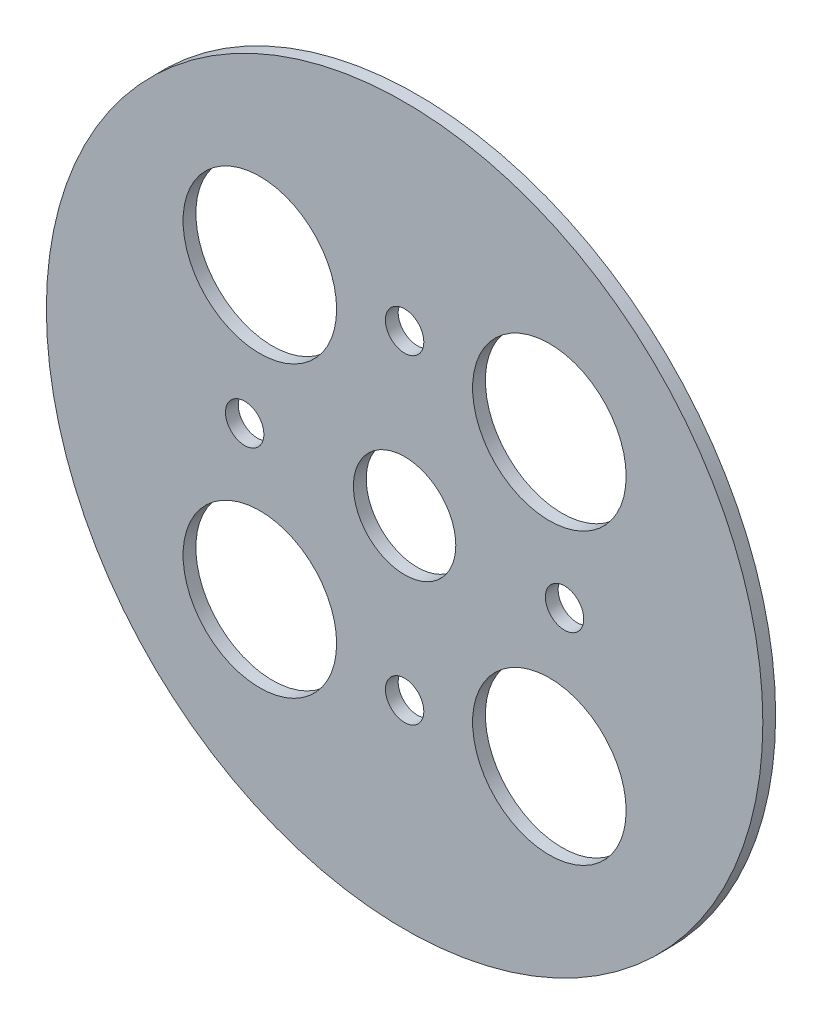
ISO-10303-21;
HEADER;
FILE_DESCRIPTION(('STEP AP214'),'2;1');
FILE_NAME('part.step','',(''),(''),'','','');
FILE_SCHEMA(('AUTOMOTIVE_DESIGN { 1 0 10303 214 1 1 1 1 }'));
ENDSEC;
DATA;
#1=APPLICATION_CONTEXT('core data for automotive mechanical design processes');
#2=APPLICATION_PROTOCOL_DEFINITION('international standard','automotive_design',2000,#1);
#3=PRODUCT_CONTEXT('',#1,'mechanical');
#4=PRODUCT('Part','Part','',(#3));
#5=PRODUCT_RELATED_PRODUCT_CATEGORY('part','',(#4));
#6=PRODUCT_DEFINITION_FORMATION('','',#4);
#7=PRODUCT_DEFINITION_CONTEXT('part definition',#1,'design');
#8=PRODUCT_DEFINITION('design','',#6,#7);
#9=PRODUCT_DEFINITION_SHAPE('','',#8);
#10=(LENGTH_UNIT() NAMED_UNIT(*) SI_UNIT(.MILLI.,.METRE.));
#11=(NAMED_UNIT(*) PLANE_ANGLE_UNIT() SI_UNIT($,.RADIAN.));
#12=(NAMED_UNIT(*) SI_UNIT($,.STERADIAN.) SOLID_ANGLE_UNIT());
#13=UNCERTAINTY_MEASURE_WITH_UNIT(LENGTH_MEASURE(1.E-05),#10,'distance_accuracy_value','');
#14=(GEOMETRIC_REPRESENTATION_CONTEXT(3) GLOBAL_UNCERTAINTY_ASSIGNED_CONTEXT((#13)) GLOBAL_UNIT_ASSIGNED_CONTEXT((#10,
#11,#12)) REPRESENTATION_CONTEXT('',''));
#15=CARTESIAN_POINT('',(0.,0.,0.));
#16=DIRECTION('',(0.,0.,1.));
#17=DIRECTION('',(1.,0.,0.));
#18=AXIS2_PLACEMENT_3D('',#15,#16,#17);
#19=CARTESIAN_POINT('',(0.,0.,1.));
#20=DIRECTION('',(0.,0.,-1.));
#21=DIRECTION('',(-1.,0.,0.));
#22=AXIS2_PLACEMENT_3D('',#19,#20,#21);
#23=CYLINDRICAL_SURFACE('',#22,28.);
#24=CARTESIAN_POINT('',(0.,0.,1.));
#25=DIRECTION('',(0.,0.,1.));
#26=DIRECTION('',(1.,0.,0.));
#27=AXIS2_PLACEMENT_3D('',#24,#25,#26);
#28=CIRCLE('',#27,28.);
#29=CARTESIAN_POINT('',(28.,0.,1.));
#30=VERTEX_POINT('',#29);
#31=EDGE_CURVE('E10',#30,#30,#28,.T.);
#32=ORIENTED_EDGE('',*,*,#31,.F.);
#33=EDGE_LOOP('',(#32));
#34=FACE_BOUND('',#33,.T.);
#35=CARTESIAN_POINT('',(0.,0.,0.));
#36=DIRECTION('',(0.,0.,1.));
#37=DIRECTION('',(1.,0.,0.));
#38=AXIS2_PLACEMENT_3D('',#35,#36,#37);
#39=CIRCLE('',#38,28.);
#40=CARTESIAN_POINT('',(28.,0.,0.));
#41=VERTEX_POINT('',#40);
#42=EDGE_CURVE('E36',#41,#41,#39,.T.);
#43=ORIENTED_EDGE('',*,*,#42,.T.);
#44=EDGE_LOOP('',(#43));
#45=FACE_BOUND('',#44,.T.);
#46=ADVANCED_FACE('F33',(#34,#45),#23,.T.);
#47=CARTESIAN_POINT('',(0.,0.,1.));
#48=DIRECTION('',(0.,0.,1.));
#49=DIRECTION('',(1.,0.,0.));
#50=AXIS2_PLACEMENT_3D('',#47,#48,#49);
#51=PLANE('',#50);
#52=CARTESIAN_POINT('',(11.3137084989847,11.3137084989848,1.));
#53=DIRECTION('',(0.,0.,1.));
#54=DIRECTION('',(1.,0.,0.));
#55=AXIS2_PLACEMENT_3D('',#52,#53,#54);
#56=CIRCLE('',#55,6.);
#57=CARTESIAN_POINT('',(17.3137084989847,11.3137084989848,1.));
#58=VERTEX_POINT('',#57);
#59=EDGE_CURVE('E85',#58,#58,#56,.T.);
#60=ORIENTED_EDGE('',*,*,#59,.F.);
#61=EDGE_LOOP('',(#60));
#62=FACE_BOUND('',#61,.T.);
#63=CARTESIAN_POINT('',(-11.3137084989848,11.3137084989847,1.));
#64=DIRECTION('',(0.,0.,1.));
#65=DIRECTION('',(1.,0.,0.));
#66=AXIS2_PLACEMENT_3D('',#63,#64,#65);
#67=CIRCLE('',#66,6.);
#68=CARTESIAN_POINT('',(-5.31370849898478,11.3137084989847,1.));
#69=VERTEX_POINT('',#68);
#70=EDGE_CURVE('E84',#69,#69,#67,.T.);
#71=ORIENTED_EDGE('',*,*,#70,.F.);
#72=EDGE_LOOP('',(#71));
#73=FACE_BOUND('',#72,.T.);
#74=CARTESIAN_POINT('',(-11.3137084989847,-11.3137084989848,1.));
#75=DIRECTION('',(0.,0.,1.));
#76=DIRECTION('',(1.,0.,0.));
#77=AXIS2_PLACEMENT_3D('',#74,#75,#76);
#78=CIRCLE('',#77,6.);
#79=CARTESIAN_POINT('',(-5.31370849898474,-11.3137084989848,1.));
#80=VERTEX_POINT('',#79);
#81=EDGE_CURVE('E91',#80,#80,#78,.T.);
#82=ORIENTED_EDGE('',*,*,#81,.F.);
#83=EDGE_LOOP('',(#82));
#84=FACE_BOUND('',#83,.T.);
#85=CARTESIAN_POINT('',(11.3137084989848,-11.3137084989847,1.));
#86=DIRECTION('',(0.,0.,1.));
#87=DIRECTION('',(1.,0.,0.));
#88=AXIS2_PLACEMENT_3D('',#85,#86,#87);
#89=CIRCLE('',#88,6.);
#90=CARTESIAN_POINT('',(17.3137084989848,-11.3137084989847,1.));
#91=VERTEX_POINT('',#90);
#92=EDGE_CURVE('E77',#91,#91,#89,.T.);
#93=ORIENTED_EDGE('',*,*,#92,.F.);
#94=EDGE_LOOP('',(#93));
#95=FACE_BOUND('',#94,.T.);
#96=CARTESIAN_POINT('',(0.,12.5,1.));
#97=DIRECTION('',(0.,0.,1.));
#98=DIRECTION('',(1.,0.,0.));
#99=AXIS2_PLACEMENT_3D('',#96,#97,#98);
#100=CIRCLE('',#99,1.5);
#101=CARTESIAN_POINT('',(1.5,12.5,1.));
#102=VERTEX_POINT('',#101);
#103=EDGE_CURVE('E68',#102,#102,#100,.T.);
#104=ORIENTED_EDGE('',*,*,#103,.F.);
#105=EDGE_LOOP('',(#104));
#106=FACE_BOUND('',#105,.T.);
#107=CARTESIAN_POINT('',(0.,-12.5,1.));
#108=DIRECTION('',(0.,0.,1.));
#109=DIRECTION('',(1.,0.,0.));
#110=AXIS2_PLACEMENT_3D('',#107,#108,#109);
#111=CIRCLE('',#110,1.5);
#112=CARTESIAN_POINT('',(1.5,-12.5,1.));
#113=VERTEX_POINT('',#112);
#114=EDGE_CURVE('E62',#113,#113,#111,.T.);
#115=ORIENTED_EDGE('',*,*,#114,.F.);
#116=EDGE_LOOP('',(#115));
#117=FACE_BOUND('',#116,.T.);
#118=CARTESIAN_POINT('',(12.5,0.,1.));
#119=DIRECTION('',(0.,0.,1.));
#120=DIRECTION('',(1.,0.,0.));
#121=AXIS2_PLACEMENT_3D('',#118,#119,#120);
#122=CIRCLE('',#121,1.5);
#123=CARTESIAN_POINT('',(14.,0.,1.));
#124=VERTEX_POINT('',#123);
#125=EDGE_CURVE('E54',#124,#124,#122,.T.);
#126=ORIENTED_EDGE('',*,*,#125,.F.);
#127=EDGE_LOOP('',(#126));
#128=FACE_BOUND('',#127,.T.);
#129=CARTESIAN_POINT('',(-12.5,0.,1.));
#130=DIRECTION('',(0.,0.,1.));
#131=DIRECTION('',(1.,0.,0.));
#132=AXIS2_PLACEMENT_3D('',#129,#130,#131);
#133=CIRCLE('',#132,1.5);
#134=CARTESIAN_POINT('',(-11.,0.,1.));
#135=VERTEX_POINT('',#134);
#136=EDGE_CURVE('E55',#135,#135,#133,.T.);
#137=ORIENTED_EDGE('',*,*,#136,.F.);
#138=EDGE_LOOP('',(#137));
#139=FACE_BOUND('',#138,.T.);
#140=CARTESIAN_POINT('',(0.,0.,1.));
#141=DIRECTION('',(0.,0.,1.));
#142=DIRECTION('',(1.,0.,0.));
#143=AXIS2_PLACEMENT_3D('',#140,#141,#142);
#144=CIRCLE('',#143,4.);
#145=CARTESIAN_POINT('',(4.,0.,1.));
#146=VERTEX_POINT('',#145);
#147=EDGE_CURVE('E45',#146,#146,#144,.T.);
#148=ORIENTED_EDGE('',*,*,#147,.F.);
#149=EDGE_LOOP('',(#148));
#150=FACE_BOUND('',#149,.T.);
#151=ORIENTED_EDGE('',*,*,#31,.T.);
#152=EDGE_LOOP('',(#151));
#153=FACE_BOUND('',#152,.T.);
#154=ADVANCED_FACE('F102',(#62,#73,#84,#95,#106,#117,#128,#139,#150,#153),#51,.T.);
#155=CARTESIAN_POINT('',(0.,0.,0.));
#156=DIRECTION('',(0.,0.,1.));
#157=DIRECTION('',(1.,0.,0.));
#158=AXIS2_PLACEMENT_3D('',#155,#156,#157);
#159=PLANE('',#158);
#160=CARTESIAN_POINT('',(11.3137084989847,11.3137084989848,0.));
#161=DIRECTION('',(0.,0.,1.));
#162=DIRECTION('',(1.,0.,0.));
#163=AXIS2_PLACEMENT_3D('',#160,#161,#162);
#164=CIRCLE('',#163,6.);
#165=CARTESIAN_POINT('',(17.3137084989847,11.3137084989848,0.));
#166=VERTEX_POINT('',#165);
#167=EDGE_CURVE('E81',#166,#166,#164,.F.);
#168=ORIENTED_EDGE('',*,*,#167,.F.);
#169=EDGE_LOOP('',(#168));
#170=FACE_BOUND('',#169,.T.);
#171=CARTESIAN_POINT('',(-11.3137084989848,11.3137084989847,0.));
#172=DIRECTION('',(0.,0.,1.));
#173=DIRECTION('',(1.,0.,0.));
#174=AXIS2_PLACEMENT_3D('',#171,#172,#173);
#175=CIRCLE('',#174,6.);
#176=CARTESIAN_POINT('',(-5.31370849898478,11.3137084989847,0.));
#177=VERTEX_POINT('',#176);
#178=EDGE_CURVE('E88',#177,#177,#175,.F.);
#179=ORIENTED_EDGE('',*,*,#178,.F.);
#180=EDGE_LOOP('',(#179));
#181=FACE_BOUND('',#180,.T.);
#182=CARTESIAN_POINT('',(-11.3137084989847,-11.3137084989848,0.));
#183=DIRECTION('',(0.,0.,1.));
#184=DIRECTION('',(1.,0.,0.));
#185=AXIS2_PLACEMENT_3D('',#182,#183,#184);
#186=CIRCLE('',#185,6.);
#187=CARTESIAN_POINT('',(-5.31370849898474,-11.3137084989848,0.));
#188=VERTEX_POINT('',#187);
#189=EDGE_CURVE('E80',#188,#188,#186,.F.);
#190=ORIENTED_EDGE('',*,*,#189,.F.);
#191=EDGE_LOOP('',(#190));
#192=FACE_BOUND('',#191,.T.);
#193=CARTESIAN_POINT('',(11.3137084989848,-11.3137084989847,0.));
#194=DIRECTION('',(0.,0.,1.));
#195=DIRECTION('',(1.,0.,0.));
#196=AXIS2_PLACEMENT_3D('',#193,#194,#195);
#197=CIRCLE('',#196,6.);
#198=CARTESIAN_POINT('',(17.3137084989848,-11.3137084989847,0.));
#199=VERTEX_POINT('',#198);
#200=EDGE_CURVE('E58',#199,#199,#197,.F.);
#201=ORIENTED_EDGE('',*,*,#200,.F.);
#202=EDGE_LOOP('',(#201));
#203=FACE_BOUND('',#202,.T.);
#204=CARTESIAN_POINT('',(0.,12.5,0.));
#205=DIRECTION('',(0.,0.,1.));
#206=DIRECTION('',(1.,0.,0.));
#207=AXIS2_PLACEMENT_3D('',#204,#205,#206);
#208=CIRCLE('',#207,1.5);
#209=CARTESIAN_POINT('',(1.5,12.5,0.));
#210=VERTEX_POINT('',#209);
#211=EDGE_CURVE('E48',#210,#210,#208,.F.);
#212=ORIENTED_EDGE('',*,*,#211,.F.);
#213=EDGE_LOOP('',(#212));
#214=FACE_BOUND('',#213,.T.);
#215=CARTESIAN_POINT('',(0.,-12.5,0.));
#216=DIRECTION('',(0.,0.,1.));
#217=DIRECTION('',(1.,0.,0.));
#218=AXIS2_PLACEMENT_3D('',#215,#216,#217);
#219=CIRCLE('',#218,1.5);
#220=CARTESIAN_POINT('',(1.5,-12.5,0.));
#221=VERTEX_POINT('',#220);
#222=EDGE_CURVE('E65',#221,#221,#219,.F.);
#223=ORIENTED_EDGE('',*,*,#222,.F.);
#224=EDGE_LOOP('',(#223));
#225=FACE_BOUND('',#224,.T.);
#226=CARTESIAN_POINT('',(12.5,0.,0.));
#227=DIRECTION('',(0.,0.,1.));
#228=DIRECTION('',(1.,0.,0.));
#229=AXIS2_PLACEMENT_3D('',#226,#227,#228);
#230=CIRCLE('',#229,1.5);
#231=CARTESIAN_POINT('',(14.,0.,0.));
#232=VERTEX_POINT('',#231);
#233=EDGE_CURVE('E59',#232,#232,#230,.F.);
#234=ORIENTED_EDGE('',*,*,#233,.F.);
#235=EDGE_LOOP('',(#234));
#236=FACE_BOUND('',#235,.T.);
#237=CARTESIAN_POINT('',(-12.5,0.,0.));
#238=DIRECTION('',(0.,0.,1.));
#239=DIRECTION('',(1.,0.,0.));
#240=AXIS2_PLACEMENT_3D('',#237,#238,#239);
#241=CIRCLE('',#240,1.5);
#242=CARTESIAN_POINT('',(-11.,0.,0.));
#243=VERTEX_POINT('',#242);
#244=EDGE_CURVE('E51',#243,#243,#241,.F.);
#245=ORIENTED_EDGE('',*,*,#244,.F.);
#246=EDGE_LOOP('',(#245));
#247=FACE_BOUND('',#246,.T.);
#248=CARTESIAN_POINT('',(0.,0.,0.));
#249=DIRECTION('',(0.,0.,1.));
#250=DIRECTION('',(1.,0.,0.));
#251=AXIS2_PLACEMENT_3D('',#248,#249,#250);
#252=CIRCLE('',#251,4.);
#253=CARTESIAN_POINT('',(4.,0.,0.));
#254=VERTEX_POINT('',#253);
#255=EDGE_CURVE('E43',#254,#254,#252,.T.);
#256=ORIENTED_EDGE('',*,*,#255,.T.);
#257=EDGE_LOOP('',(#256));
#258=FACE_BOUND('',#257,.T.);
#259=ORIENTED_EDGE('',*,*,#42,.F.);
#260=EDGE_LOOP('',(#259));
#261=FACE_BOUND('',#260,.T.);
#262=ADVANCED_FACE('F105',(#170,#181,#192,#203,#214,#225,#236,#247,#258,#261),#159,.F.);
#263=CARTESIAN_POINT('',(0.,0.,0.));
#264=DIRECTION('',(0.,0.,1.));
#265=DIRECTION('',(1.,0.,0.));
#266=AXIS2_PLACEMENT_3D('',#263,#264,#265);
#267=CYLINDRICAL_SURFACE('',#266,4.);
#268=ORIENTED_EDGE('',*,*,#255,.F.);
#269=EDGE_LOOP('',(#268));
#270=FACE_BOUND('',#269,.T.);
#271=ORIENTED_EDGE('',*,*,#147,.T.);
#272=EDGE_LOOP('',(#271));
#273=FACE_BOUND('',#272,.T.);
#274=ADVANCED_FACE('F120',(#270,#273),#267,.F.);
#275=CARTESIAN_POINT('',(-12.5,0.,-0.000999999999999916));
#276=DIRECTION('',(0.,0.,1.));
#277=DIRECTION('',(1.,0.,0.));
#278=AXIS2_PLACEMENT_3D('',#275,#276,#277);
#279=CYLINDRICAL_SURFACE('',#278,1.5);
#280=ORIENTED_EDGE('',*,*,#136,.T.);
#281=EDGE_LOOP('',(#280));
#282=FACE_BOUND('',#281,.T.);
#283=ORIENTED_EDGE('',*,*,#244,.T.);
#284=EDGE_LOOP('',(#283));
#285=FACE_BOUND('',#284,.T.);
#286=ADVANCED_FACE('F122',(#282,#285),#279,.F.);
#287=CARTESIAN_POINT('',(12.5,0.,-0.000999999999999916));
#288=DIRECTION('',(0.,0.,1.));
#289=DIRECTION('',(1.,0.,0.));
#290=AXIS2_PLACEMENT_3D('',#287,#288,#289);
#291=CYLINDRICAL_SURFACE('',#290,1.5);
#292=ORIENTED_EDGE('',*,*,#125,.T.);
#293=EDGE_LOOP('',(#292));
#294=FACE_BOUND('',#293,.T.);
#295=ORIENTED_EDGE('',*,*,#233,.T.);
#296=EDGE_LOOP('',(#295));
#297=FACE_BOUND('',#296,.T.);
#298=ADVANCED_FACE('F129',(#294,#297),#291,.F.);
#299=CARTESIAN_POINT('',(0.,-12.5,-0.000999999999999916));
#300=DIRECTION('',(0.,0.,1.));
#301=DIRECTION('',(1.,0.,0.));
#302=AXIS2_PLACEMENT_3D('',#299,#300,#301);
#303=CYLINDRICAL_SURFACE('',#302,1.5);
#304=ORIENTED_EDGE('',*,*,#114,.T.);
#305=EDGE_LOOP('',(#304));
#306=FACE_BOUND('',#305,.T.);
#307=ORIENTED_EDGE('',*,*,#222,.T.);
#308=EDGE_LOOP('',(#307));
#309=FACE_BOUND('',#308,.T.);
#310=ADVANCED_FACE('F201',(#306,#309),#303,.F.);
#311=CARTESIAN_POINT('',(0.,12.5,-0.000999999999999916));
#312=DIRECTION('',(0.,0.,1.));
#313=DIRECTION('',(1.,0.,0.));
#314=AXIS2_PLACEMENT_3D('',#311,#312,#313);
#315=CYLINDRICAL_SURFACE('',#314,1.5);
#316=ORIENTED_EDGE('',*,*,#103,.T.);
#317=EDGE_LOOP('',(#316));
#318=FACE_BOUND('',#317,.T.);
#319=ORIENTED_EDGE('',*,*,#211,.T.);
#320=EDGE_LOOP('',(#319));
#321=FACE_BOUND('',#320,.T.);
#322=ADVANCED_FACE('F163',(#318,#321),#315,.F.);
#323=CARTESIAN_POINT('',(11.3137084989848,-11.3137084989847,-0.000999999999999916));
#324=DIRECTION('',(0.,0.,1.));
#325=DIRECTION('',(1.,0.,0.));
#326=AXIS2_PLACEMENT_3D('',#323,#324,#325);
#327=CYLINDRICAL_SURFACE('',#326,6.);
#328=ORIENTED_EDGE('',*,*,#92,.T.);
#329=EDGE_LOOP('',(#328));
#330=FACE_BOUND('',#329,.T.);
#331=ORIENTED_EDGE('',*,*,#200,.T.);
#332=EDGE_LOOP('',(#331));
#333=FACE_BOUND('',#332,.T.);
#334=ADVANCED_FACE('F158',(#330,#333),#327,.F.);
#335=CARTESIAN_POINT('',(-11.3137084989847,-11.3137084989848,-0.000999999999999916));
#336=DIRECTION('',(0.,0.,1.));
#337=DIRECTION('',(1.,0.,0.));
#338=AXIS2_PLACEMENT_3D('',#335,#336,#337);
#339=CYLINDRICAL_SURFACE('',#338,6.);
#340=ORIENTED_EDGE('',*,*,#81,.T.);
#341=EDGE_LOOP('',(#340));
#342=FACE_BOUND('',#341,.T.);
#343=ORIENTED_EDGE('',*,*,#189,.T.);
#344=EDGE_LOOP('',(#343));
#345=FACE_BOUND('',#344,.T.);
#346=ADVANCED_FACE('F99',(#342,#345),#339,.F.);
#347=CARTESIAN_POINT('',(-11.3137084989848,11.3137084989847,-0.000999999999999916));
#348=DIRECTION('',(0.,0.,1.));
#349=DIRECTION('',(1.,0.,0.));
#350=AXIS2_PLACEMENT_3D('',#347,#348,#349);
#351=CYLINDRICAL_SURFACE('',#350,6.);
#352=ORIENTED_EDGE('',*,*,#70,.T.);
#353=EDGE_LOOP('',(#352));
#354=FACE_BOUND('',#353,.T.);
#355=ORIENTED_EDGE('',*,*,#178,.T.);
#356=EDGE_LOOP('',(#355));
#357=FACE_BOUND('',#356,.T.);
#358=ADVANCED_FACE('F175',(#354,#357),#351,.F.);
#359=CARTESIAN_POINT('',(11.3137084989847,11.3137084989848,-0.000999999999999916));
#360=DIRECTION('',(0.,0.,1.));
#361=DIRECTION('',(1.,0.,0.));
#362=AXIS2_PLACEMENT_3D('',#359,#360,#361);
#363=CYLINDRICAL_SURFACE('',#362,6.);
#364=ORIENTED_EDGE('',*,*,#59,.T.);
#365=EDGE_LOOP('',(#364));
#366=FACE_BOUND('',#365,.T.);
#367=ORIENTED_EDGE('',*,*,#167,.T.);
#368=EDGE_LOOP('',(#367));
#369=FACE_BOUND('',#368,.T.);
#370=ADVANCED_FACE('F184',(#366,#369),#363,.F.);
#371=CLOSED_SHELL('',(#46,#154,#262,#274,#286,#298,#310,#322,#334,#346,#358,#370));
#372=MANIFOLD_SOLID_BREP('B2',#371);
#373=ADVANCED_BREP_SHAPE_REPRESENTATION('',(#18,#372),#14);
#374=SHAPE_DEFINITION_REPRESENTATION(#9,#373);
ENDSEC;
END-ISO-10303-21;
